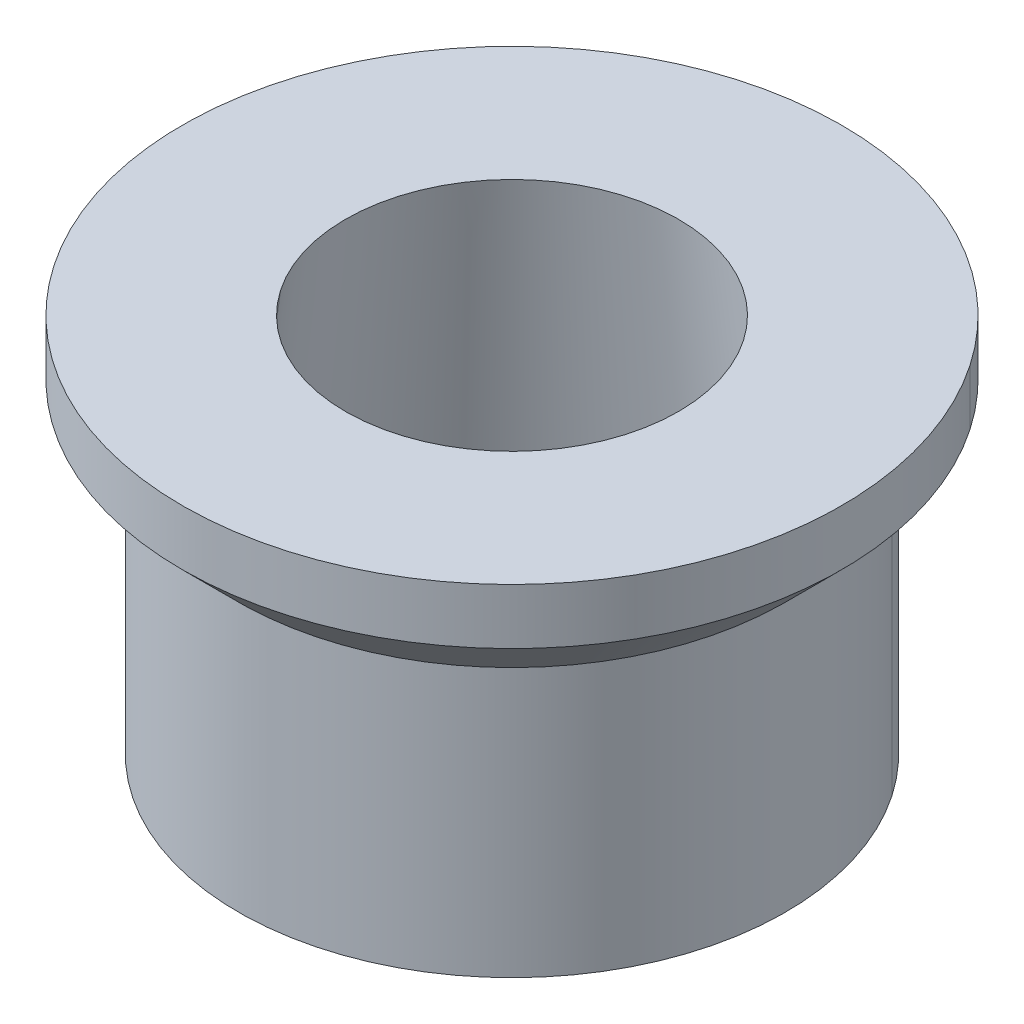
ISO-10303-21;
HEADER;
FILE_DESCRIPTION(('STEP AP214'),'2;1');
FILE_NAME('part.step','',(''),(''),'','','');
FILE_SCHEMA(('AUTOMOTIVE_DESIGN { 1 0 10303 214 1 1 1 1 }'));
ENDSEC;
DATA;
#1=APPLICATION_CONTEXT('core data for automotive mechanical design processes');
#2=APPLICATION_PROTOCOL_DEFINITION('international standard','automotive_design',2000,#1);
#3=PRODUCT_CONTEXT('',#1,'mechanical');
#4=PRODUCT('Part','Part','',(#3));
#5=PRODUCT_RELATED_PRODUCT_CATEGORY('part','',(#4));
#6=PRODUCT_DEFINITION_FORMATION('','',#4);
#7=PRODUCT_DEFINITION_CONTEXT('part definition',#1,'design');
#8=PRODUCT_DEFINITION('design','',#6,#7);
#9=PRODUCT_DEFINITION_SHAPE('','',#8);
#10=(LENGTH_UNIT() NAMED_UNIT(*) SI_UNIT(.MILLI.,.METRE.));
#11=(NAMED_UNIT(*) PLANE_ANGLE_UNIT() SI_UNIT($,.RADIAN.));
#12=(NAMED_UNIT(*) SI_UNIT($,.STERADIAN.) SOLID_ANGLE_UNIT());
#13=UNCERTAINTY_MEASURE_WITH_UNIT(LENGTH_MEASURE(1.E-05),#10,'distance_accuracy_value','');
#14=(GEOMETRIC_REPRESENTATION_CONTEXT(3) GLOBAL_UNCERTAINTY_ASSIGNED_CONTEXT((#13)) GLOBAL_UNIT_ASSIGNED_CONTEXT((#10,
#11,#12)) REPRESENTATION_CONTEXT('',''));
#15=CARTESIAN_POINT('',(0.,0.,0.));
#16=DIRECTION('',(0.,0.,1.));
#17=DIRECTION('',(1.,0.,0.));
#18=AXIS2_PLACEMENT_3D('',#15,#16,#17);
#19=CARTESIAN_POINT('',(148.680515830146,50.0482,264.647028456528));
#20=DIRECTION('',(0.,-1.,0.));
#21=DIRECTION('',(-0.826013135504955,0.,0.563650867091742));
#22=AXIS2_PLACEMENT_3D('',#19,#20,#21);
#23=CONICAL_SURFACE('',#22,3.81,0.109054658443238);
#24=DIRECTION('',(0.089902133007635,-0.994059431796384,-0.0613469847451919));
#25=VECTOR('',#24,1.);
#26=CARTESIAN_POINT('',(151.82762587642,50.0482,262.499518652908));
#27=LINE('',#26,#25);
#28=CARTESIAN_POINT('',(151.198203867165,57.0078,262.929020613632));
#29=VERTEX_POINT('',#28);
#30=CARTESIAN_POINT('',(151.82762587642,50.0482,262.499518652908));
#31=VERTEX_POINT('',#30);
#32=EDGE_CURVE('E148',#29,#31,#27,.T.);
#33=ORIENTED_EDGE('',*,*,#32,.F.);
#34=CARTESIAN_POINT('',(148.680515830146,57.0078,264.647028456528));
#35=DIRECTION('',(0.,1.,0.));
#36=DIRECTION('',(0.826013135504955,0.,-0.563650867091742));
#37=AXIS2_PLACEMENT_3D('',#34,#35,#36);
#38=CIRCLE('',#37,3.048);
#39=CARTESIAN_POINT('',(146.162827793127,57.0078,266.365036299424));
#40=VERTEX_POINT('',#39);
#41=EDGE_CURVE('E115',#29,#40,#38,.T.);
#42=ORIENTED_EDGE('',*,*,#41,.T.);
#43=DIRECTION('',(-0.089902133007636,-0.994059431796384,0.0613469847451926));
#44=VECTOR('',#43,1.);
#45=CARTESIAN_POINT('',(145.533405783872,50.0482,266.794538260148));
#46=LINE('',#45,#44);
#47=CARTESIAN_POINT('',(145.533405783872,50.0482,266.794538260148));
#48=VERTEX_POINT('',#47);
#49=EDGE_CURVE('E147',#40,#48,#46,.T.);
#50=ORIENTED_EDGE('',*,*,#49,.T.);
#51=CARTESIAN_POINT('',(148.680515830146,50.0482,264.647028456528));
#52=DIRECTION('',(0.,1.,0.));
#53=DIRECTION('',(0.826013135504955,0.,-0.563650867091742));
#54=AXIS2_PLACEMENT_3D('',#51,#52,#53);
#55=CIRCLE('',#54,3.81);
#56=EDGE_CURVE('E11',#31,#48,#55,.T.);
#57=ORIENTED_EDGE('',*,*,#56,.F.);
#58=EDGE_LOOP('',(#33,#42,#50,#57));
#59=FACE_BOUND('',#58,.T.);
#60=ADVANCED_FACE('F42',(#59),#23,.F.);
#61=CARTESIAN_POINT('',(146.533006026526,50.0482,261.499918410254));
#62=DIRECTION('',(0.,-1.,0.));
#63=DIRECTION('',(-0.563650867091742,0.,-0.826013135504955));
#64=AXIS2_PLACEMENT_3D('',#61,#62,#63);
#65=PLANE('',#64);
#66=CARTESIAN_POINT('',(148.680515830146,50.0482,264.647028456528));
#67=DIRECTION('',(0.,1.,0.));
#68=DIRECTION('',(0.826013135504955,0.,-0.563650867091742));
#69=AXIS2_PLACEMENT_3D('',#66,#67,#68);
#70=CIRCLE('',#69,3.81);
#71=EDGE_CURVE('E144',#48,#31,#70,.T.);
#72=ORIENTED_EDGE('',*,*,#71,.T.);
#73=ORIENTED_EDGE('',*,*,#56,.T.);
#74=EDGE_LOOP('',(#72,#73));
#75=FACE_BOUND('',#74,.T.);
#76=CARTESIAN_POINT('',(148.680515830146,50.0482,264.647028456528));
#77=DIRECTION('',(0.,1.,0.));
#78=DIRECTION('',(0.826013135504955,0.,-0.563650867091742));
#79=AXIS2_PLACEMENT_3D('',#76,#77,#78);
#80=CIRCLE('',#79,5.0038);
#81=CARTESIAN_POINT('',(152.813720357586,50.0482,261.826632247774));
#82=VERTEX_POINT('',#81);
#83=CARTESIAN_POINT('',(144.547311302706,50.0482,267.467424665282));
#84=VERTEX_POINT('',#83);
#85=EDGE_CURVE('E166',#82,#84,#80,.T.);
#86=ORIENTED_EDGE('',*,*,#85,.F.);
#87=CARTESIAN_POINT('',(148.680515830146,50.0482,264.647028456528));
#88=DIRECTION('',(0.,1.,0.));
#89=DIRECTION('',(0.826013135504955,0.,-0.563650867091742));
#90=AXIS2_PLACEMENT_3D('',#87,#88,#89);
#91=CIRCLE('',#90,5.0038);
#92=EDGE_CURVE('E53',#84,#82,#91,.T.);
#93=ORIENTED_EDGE('',*,*,#92,.F.);
#94=EDGE_LOOP('',(#86,#93));
#95=FACE_BOUND('',#94,.T.);
#96=ADVANCED_FACE('F170',(#75,#95),#65,.T.);
#97=CARTESIAN_POINT('',(148.680515830146,57.0078,264.647028456528));
#98=DIRECTION('',(0.,1.,0.));
#99=DIRECTION('',(0.826013135504955,0.,-0.563650867091742));
#100=AXIS2_PLACEMENT_3D('',#97,#98,#99);
#101=CYLINDRICAL_SURFACE('',#100,5.0038);
#102=DIRECTION('',(0.,1.,0.));
#103=VECTOR('',#102,1.);
#104=CARTESIAN_POINT('',(144.547311302706,57.0078,267.467424665282));
#105=LINE('',#104,#103);
#106=CARTESIAN_POINT('',(144.547311302706,54.9631,267.467424665282));
#107=VERTEX_POINT('',#106);
#108=EDGE_CURVE('E160',#84,#107,#105,.T.);
#109=ORIENTED_EDGE('',*,*,#108,.F.);
#110=ORIENTED_EDGE('',*,*,#92,.T.);
#111=DIRECTION('',(0.,1.,0.));
#112=VECTOR('',#111,1.);
#113=CARTESIAN_POINT('',(152.813720357586,57.0078,261.826632247774));
#114=LINE('',#113,#112);
#115=CARTESIAN_POINT('',(152.813720357586,54.9631,261.826632247774));
#116=VERTEX_POINT('',#115);
#117=EDGE_CURVE('E140',#82,#116,#114,.T.);
#118=ORIENTED_EDGE('',*,*,#117,.T.);
#119=CARTESIAN_POINT('',(148.680515830146,54.9631,264.647028456528));
#120=DIRECTION('',(0.,1.,0.));
#121=DIRECTION('',(0.826013135504955,0.,-0.563650867091742));
#122=AXIS2_PLACEMENT_3D('',#119,#120,#121);
#123=CIRCLE('',#122,5.0038);
#124=EDGE_CURVE('E114',#107,#116,#123,.T.);
#125=ORIENTED_EDGE('',*,*,#124,.F.);
#126=EDGE_LOOP('',(#109,#110,#118,#125));
#127=FACE_BOUND('',#126,.T.);
#128=ADVANCED_FACE('F157',(#127),#101,.T.);
#129=CARTESIAN_POINT('',(148.680515830146,55.9918,264.647028456528));
#130=DIRECTION('',(0.,1.,0.));
#131=DIRECTION('',(0.826013135504955,0.,-0.563650867091742));
#132=AXIS2_PLACEMENT_3D('',#129,#130,#131);
#133=CONICAL_SURFACE('',#132,6.0325,0.78539816339745);
#134=DIRECTION('',(-0.584079489464717,0.707106781186546,0.398561350342249));
#135=VECTOR('',#134,1.);
#136=CARTESIAN_POINT('',(143.697591590212,55.9918,268.047252312259));
#137=LINE('',#136,#135);
#138=CARTESIAN_POINT('',(143.697591590212,55.9918,268.047252312259));
#139=VERTEX_POINT('',#138);
#140=EDGE_CURVE('E134',#107,#139,#137,.T.);
#141=ORIENTED_EDGE('',*,*,#140,.F.);
#142=ORIENTED_EDGE('',*,*,#124,.T.);
#143=DIRECTION('',(0.584079489464718,0.707106781186546,-0.398561350342249));
#144=VECTOR('',#143,1.);
#145=CARTESIAN_POINT('',(153.66344007008,55.9918,261.246804600797));
#146=LINE('',#145,#144);
#147=CARTESIAN_POINT('',(153.66344007008,55.9918,261.246804600797));
#148=VERTEX_POINT('',#147);
#149=EDGE_CURVE('E126',#116,#148,#146,.T.);
#150=ORIENTED_EDGE('',*,*,#149,.T.);
#151=CARTESIAN_POINT('',(148.680515830146,55.9918,264.647028456528));
#152=DIRECTION('',(0.,1.,0.));
#153=DIRECTION('',(0.826013135504955,0.,-0.563650867091742));
#154=AXIS2_PLACEMENT_3D('',#151,#152,#153);
#155=CIRCLE('',#154,6.0325);
#156=EDGE_CURVE('E102',#139,#148,#155,.T.);
#157=ORIENTED_EDGE('',*,*,#156,.F.);
#158=EDGE_LOOP('',(#141,#142,#150,#157));
#159=FACE_BOUND('',#158,.T.);
#160=ADVANCED_FACE('F127',(#159),#133,.T.);
#161=CARTESIAN_POINT('',(148.680515830146,57.0078,264.647028456528));
#162=DIRECTION('',(0.,1.,0.));
#163=DIRECTION('',(0.826013135504955,0.,-0.563650867091742));
#164=AXIS2_PLACEMENT_3D('',#161,#162,#163);
#165=CYLINDRICAL_SURFACE('',#164,6.0325);
#166=DIRECTION('',(0.,1.,0.));
#167=VECTOR('',#166,1.);
#168=CARTESIAN_POINT('',(143.697591590212,57.0078,268.047252312259));
#169=LINE('',#168,#167);
#170=CARTESIAN_POINT('',(143.697591590212,57.0078,268.047252312259));
#171=VERTEX_POINT('',#170);
#172=EDGE_CURVE('E46',#139,#171,#169,.T.);
#173=ORIENTED_EDGE('',*,*,#172,.F.);
#174=ORIENTED_EDGE('',*,*,#156,.T.);
#175=DIRECTION('',(0.,1.,0.));
#176=VECTOR('',#175,1.);
#177=CARTESIAN_POINT('',(153.66344007008,57.0078,261.246804600797));
#178=LINE('',#177,#176);
#179=CARTESIAN_POINT('',(153.66344007008,57.0078,261.246804600797));
#180=VERTEX_POINT('',#179);
#181=EDGE_CURVE('E109',#148,#180,#178,.T.);
#182=ORIENTED_EDGE('',*,*,#181,.T.);
#183=CARTESIAN_POINT('',(148.680515830146,57.0078,264.647028456528));
#184=DIRECTION('',(0.,1.,0.));
#185=DIRECTION('',(0.826013135504955,0.,-0.563650867091742));
#186=AXIS2_PLACEMENT_3D('',#183,#184,#185);
#187=CIRCLE('',#186,6.0325);
#188=EDGE_CURVE('E65',#171,#180,#187,.T.);
#189=ORIENTED_EDGE('',*,*,#188,.F.);
#190=EDGE_LOOP('',(#173,#174,#182,#189));
#191=FACE_BOUND('',#190,.T.);
#192=ADVANCED_FACE('F108',(#191),#165,.T.);
#193=CARTESIAN_POINT('',(145.280291974415,57.0078,259.664104216594));
#194=DIRECTION('',(0.,1.,0.));
#195=DIRECTION('',(0.826013135504955,0.,-0.563650867091742));
#196=AXIS2_PLACEMENT_3D('',#193,#194,#195);
#197=PLANE('',#196);
#198=CARTESIAN_POINT('',(148.680515830146,57.0078,264.647028456528));
#199=DIRECTION('',(0.,1.,0.));
#200=DIRECTION('',(0.826013135504955,0.,-0.563650867091742));
#201=AXIS2_PLACEMENT_3D('',#198,#199,#200);
#202=CIRCLE('',#201,3.048);
#203=EDGE_CURVE('E187',#40,#29,#202,.T.);
#204=ORIENTED_EDGE('',*,*,#203,.F.);
#205=ORIENTED_EDGE('',*,*,#41,.F.);
#206=EDGE_LOOP('',(#204,#205));
#207=FACE_BOUND('',#206,.T.);
#208=CARTESIAN_POINT('',(148.680515830146,57.0078,264.647028456528));
#209=DIRECTION('',(0.,1.,0.));
#210=DIRECTION('',(0.826013135504955,0.,-0.563650867091742));
#211=AXIS2_PLACEMENT_3D('',#208,#209,#210);
#212=CIRCLE('',#211,6.0325);
#213=EDGE_CURVE('E122',#180,#171,#212,.T.);
#214=ORIENTED_EDGE('',*,*,#213,.T.);
#215=ORIENTED_EDGE('',*,*,#188,.T.);
#216=EDGE_LOOP('',(#214,#215));
#217=FACE_BOUND('',#216,.T.);
#218=ADVANCED_FACE('F211',(#207,#217),#197,.T.);
#219=CARTESIAN_POINT('',(148.680515830146,57.0078,264.647028456528));
#220=DIRECTION('',(0.,1.,0.));
#221=DIRECTION('',(0.826013135504955,0.,-0.563650867091742));
#222=AXIS2_PLACEMENT_3D('',#219,#220,#221);
#223=CYLINDRICAL_SURFACE('',#222,6.0325);
#224=CARTESIAN_POINT('',(148.680515830146,55.9918,264.647028456528));
#225=DIRECTION('',(0.,1.,0.));
#226=DIRECTION('',(0.826013135504955,0.,-0.563650867091742));
#227=AXIS2_PLACEMENT_3D('',#224,#225,#226);
#228=CIRCLE('',#227,6.0325);
#229=EDGE_CURVE('E120',#148,#139,#228,.T.);
#230=ORIENTED_EDGE('',*,*,#229,.T.);
#231=ORIENTED_EDGE('',*,*,#172,.T.);
#232=ORIENTED_EDGE('',*,*,#213,.F.);
#233=ORIENTED_EDGE('',*,*,#181,.F.);
#234=EDGE_LOOP('',(#230,#231,#232,#233));
#235=FACE_BOUND('',#234,.T.);
#236=ADVANCED_FACE('F118',(#235),#223,.T.);
#237=CARTESIAN_POINT('',(148.680515830146,55.9918,264.647028456528));
#238=DIRECTION('',(0.,1.,0.));
#239=DIRECTION('',(0.826013135504955,0.,-0.563650867091742));
#240=AXIS2_PLACEMENT_3D('',#237,#238,#239);
#241=CONICAL_SURFACE('',#240,6.0325,0.78539816339745);
#242=CARTESIAN_POINT('',(148.680515830146,54.9631,264.647028456528));
#243=DIRECTION('',(0.,1.,0.));
#244=DIRECTION('',(0.826013135504955,0.,-0.563650867091742));
#245=AXIS2_PLACEMENT_3D('',#242,#243,#244);
#246=CIRCLE('',#245,5.0038);
#247=EDGE_CURVE('E167',#116,#107,#246,.T.);
#248=ORIENTED_EDGE('',*,*,#247,.T.);
#249=ORIENTED_EDGE('',*,*,#140,.T.);
#250=ORIENTED_EDGE('',*,*,#229,.F.);
#251=ORIENTED_EDGE('',*,*,#149,.F.);
#252=EDGE_LOOP('',(#248,#249,#250,#251));
#253=FACE_BOUND('',#252,.T.);
#254=ADVANCED_FACE('F44',(#253),#241,.T.);
#255=CARTESIAN_POINT('',(148.680515830146,57.0078,264.647028456528));
#256=DIRECTION('',(0.,1.,0.));
#257=DIRECTION('',(0.826013135504955,0.,-0.563650867091742));
#258=AXIS2_PLACEMENT_3D('',#255,#256,#257);
#259=CYLINDRICAL_SURFACE('',#258,5.0038);
#260=ORIENTED_EDGE('',*,*,#85,.T.);
#261=ORIENTED_EDGE('',*,*,#108,.T.);
#262=ORIENTED_EDGE('',*,*,#247,.F.);
#263=ORIENTED_EDGE('',*,*,#117,.F.);
#264=EDGE_LOOP('',(#260,#261,#262,#263));
#265=FACE_BOUND('',#264,.T.);
#266=ADVANCED_FACE('F165',(#265),#259,.T.);
#267=CARTESIAN_POINT('',(148.680515830146,50.0482,264.647028456528));
#268=DIRECTION('',(0.,-1.,0.));
#269=DIRECTION('',(-0.826013135504955,0.,0.563650867091742));
#270=AXIS2_PLACEMENT_3D('',#267,#268,#269);
#271=CONICAL_SURFACE('',#270,3.81,0.109054658443238);
#272=ORIENTED_EDGE('',*,*,#203,.T.);
#273=ORIENTED_EDGE('',*,*,#32,.T.);
#274=ORIENTED_EDGE('',*,*,#71,.F.);
#275=ORIENTED_EDGE('',*,*,#49,.F.);
#276=EDGE_LOOP('',(#272,#273,#274,#275));
#277=FACE_BOUND('',#276,.T.);
#278=ADVANCED_FACE('F197',(#277),#271,.F.);
#279=CLOSED_SHELL('',(#60,#96,#128,#160,#192,#218,#236,#254,#266,#278));
#280=MANIFOLD_SOLID_BREP('B2',#279);
#281=ADVANCED_BREP_SHAPE_REPRESENTATION('',(#18,#280),#14);
#282=SHAPE_DEFINITION_REPRESENTATION(#9,#281);
ENDSEC;
END-ISO-10303-21;
